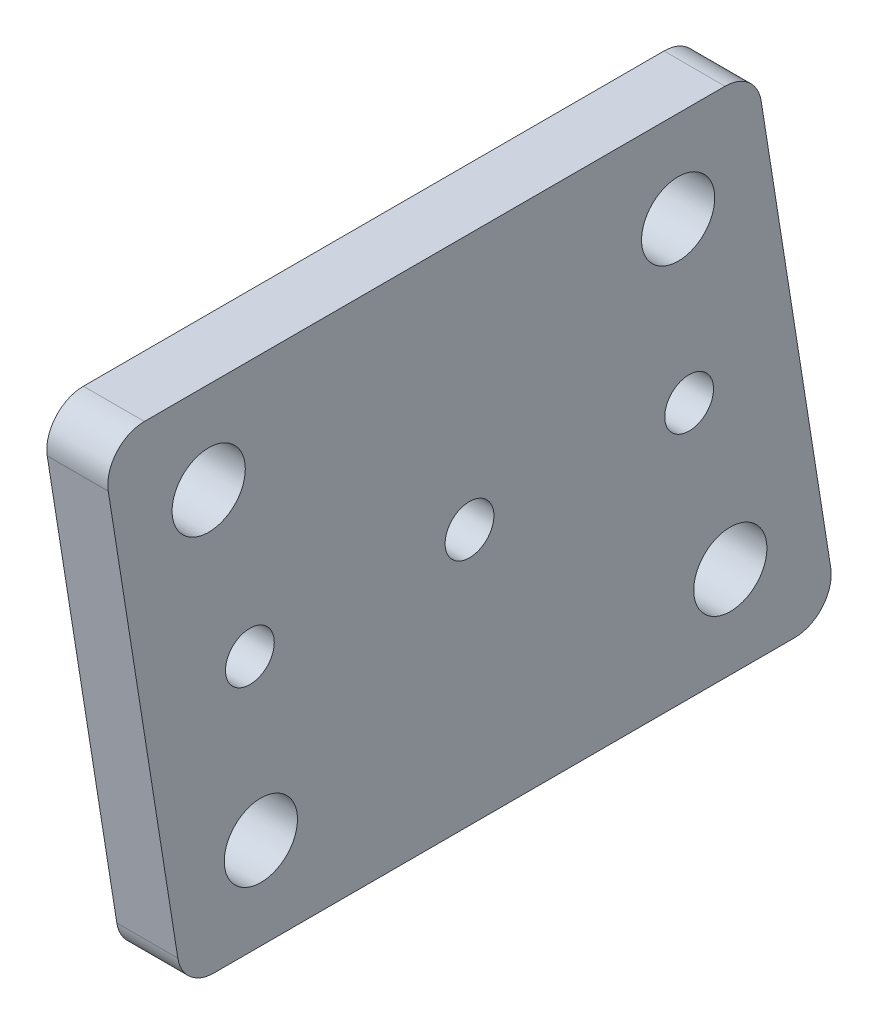
ISO-10303-21;
HEADER;
FILE_DESCRIPTION(('STEP AP214'),'2;1');
FILE_NAME('part.step','',(''),(''),'','','');
FILE_SCHEMA(('AUTOMOTIVE_DESIGN { 1 0 10303 214 1 1 1 1 }'));
ENDSEC;
DATA;
#1=APPLICATION_CONTEXT('core data for automotive mechanical design processes');
#2=APPLICATION_PROTOCOL_DEFINITION('international standard','automotive_design',2000,#1);
#3=PRODUCT_CONTEXT('',#1,'mechanical');
#4=PRODUCT('Part','Part','',(#3));
#5=PRODUCT_RELATED_PRODUCT_CATEGORY('part','',(#4));
#6=PRODUCT_DEFINITION_FORMATION('','',#4);
#7=PRODUCT_DEFINITION_CONTEXT('part definition',#1,'design');
#8=PRODUCT_DEFINITION('design','',#6,#7);
#9=PRODUCT_DEFINITION_SHAPE('','',#8);
#10=(LENGTH_UNIT() NAMED_UNIT(*) SI_UNIT(.MILLI.,.METRE.));
#11=(NAMED_UNIT(*) PLANE_ANGLE_UNIT() SI_UNIT($,.RADIAN.));
#12=(NAMED_UNIT(*) SI_UNIT($,.STERADIAN.) SOLID_ANGLE_UNIT());
#13=UNCERTAINTY_MEASURE_WITH_UNIT(LENGTH_MEASURE(1.E-05),#10,'distance_accuracy_value','');
#14=(GEOMETRIC_REPRESENTATION_CONTEXT(3) GLOBAL_UNCERTAINTY_ASSIGNED_CONTEXT((#13)) GLOBAL_UNIT_ASSIGNED_CONTEXT((#10,
#11,#12)) REPRESENTATION_CONTEXT('',''));
#15=CARTESIAN_POINT('',(0.,0.,0.));
#16=DIRECTION('',(0.,0.,1.));
#17=DIRECTION('',(1.,0.,0.));
#18=AXIS2_PLACEMENT_3D('',#15,#16,#17);
#19=CARTESIAN_POINT('',(5.,0.,0.));
#20=DIRECTION('',(1.,0.,0.));
#21=DIRECTION('',(0.,0.,-1.));
#22=AXIS2_PLACEMENT_3D('',#19,#20,#21);
#23=PLANE('',#22);
#24=CARTESIAN_POINT('',(5.,13.5,0.901352554409224));
#25=DIRECTION('',(1.,0.,0.));
#26=DIRECTION('',(0.,0.,-1.));
#27=AXIS2_PLACEMENT_3D('',#24,#25,#26);
#28=CIRCLE('',#27,2.);
#29=CARTESIAN_POINT('',(5.,13.5,-1.09864744559078));
#30=VERTEX_POINT('',#29);
#31=EDGE_CURVE('E205',#30,#30,#28,.T.);
#32=ORIENTED_EDGE('',*,*,#31,.F.);
#33=EDGE_LOOP('',(#32));
#34=FACE_BOUND('',#33,.T.);
#35=CARTESIAN_POINT('',(5.,27.,-34.1972948911816));
#36=DIRECTION('',(1.,0.,0.));
#37=DIRECTION('',(0.,0.,-1.));
#38=AXIS2_PLACEMENT_3D('',#35,#36,#37);
#39=CIRCLE('',#38,2.99999999999999);
#40=CARTESIAN_POINT('',(5.,27.,-37.1972948911815));
#41=VERTEX_POINT('',#40);
#42=EDGE_CURVE('E193',#41,#41,#39,.T.);
#43=ORIENTED_EDGE('',*,*,#42,.F.);
#44=EDGE_LOOP('',(#43));
#45=FACE_BOUND('',#44,.T.);
#46=CARTESIAN_POINT('',(5.,0.,-38.4736747799441));
#47=DIRECTION('',(1.,0.,0.));
#48=DIRECTION('',(0.,0.,-1.));
#49=AXIS2_PLACEMENT_3D('',#46,#47,#48);
#50=CIRCLE('',#49,3.);
#51=CARTESIAN_POINT('',(5.,0.,-41.4736747799441));
#52=VERTEX_POINT('',#51);
#53=EDGE_CURVE('E182',#52,#52,#50,.T.);
#54=ORIENTED_EDGE('',*,*,#53,.F.);
#55=EDGE_LOOP('',(#54));
#56=FACE_BOUND('',#55,.T.);
#57=DIRECTION('',(0.,0.987688340595137,0.156434465040235));
#58=VECTOR('',#57,1.);
#59=CARTESIAN_POINT('',(5.,-7.5,-47.2550465257882));
#60=LINE('',#59,#58);
#61=CARTESIAN_POINT('',(5.,-4.0306966048793,-46.705562849236));
#62=VERTEX_POINT('',#61);
#63=CARTESIAN_POINT('',(5.,31.9693033951207,-41.0037229975525));
#64=VERTEX_POINT('',#63);
#65=EDGE_CURVE('E177',#62,#64,#60,.T.);
#66=ORIENTED_EDGE('',*,*,#65,.T.);
#67=CARTESIAN_POINT('',(5.,31.5,-38.0406579757671));
#68=DIRECTION('',(1.,0.,0.));
#69=DIRECTION('',(0.,0.,-1.));
#70=AXIS2_PLACEMENT_3D('',#67,#68,#69);
#71=CIRCLE('',#70,3.);
#72=CARTESIAN_POINT('',(5.,34.5,-38.0406579757671));
#73=VERTEX_POINT('',#72);
#74=EDGE_CURVE('E154',#64,#73,#71,.T.);
#75=ORIENTED_EDGE('',*,*,#74,.T.);
#76=DIRECTION('',(0.,0.,1.));
#77=VECTOR('',#76,1.);
#78=CARTESIAN_POINT('',(5.,34.5,-40.6029000321575));
#79=LINE('',#78,#77);
#80=CARTESIAN_POINT('',(5.,34.5,9.54520293626902));
#81=VERTEX_POINT('',#80);
#82=EDGE_CURVE('E125',#73,#81,#79,.T.);
#83=ORIENTED_EDGE('',*,*,#82,.T.);
#84=CARTESIAN_POINT('',(5.,31.5,9.54520293626903));
#85=DIRECTION('',(1.,0.,0.));
#86=DIRECTION('',(0.,0.,-1.));
#87=AXIS2_PLACEMENT_3D('',#84,#85,#86);
#88=CIRCLE('',#87,3.);
#89=CARTESIAN_POINT('',(5.,31.0306966048793,12.5082679580544));
#90=VERTEX_POINT('',#89);
#91=EDGE_CURVE('E149',#81,#90,#88,.T.);
#92=ORIENTED_EDGE('',*,*,#91,.T.);
#93=DIRECTION('',(0.,-0.987688340595137,-0.156434465040235));
#94=VECTOR('',#93,1.);
#95=CARTESIAN_POINT('',(5.,34.5,13.0577516346067));
#96=LINE('',#95,#94);
#97=CARTESIAN_POINT('',(5.,-4.96930339512069,6.806428106371));
#98=VERTEX_POINT('',#97);
#99=EDGE_CURVE('E132',#90,#98,#96,.T.);
#100=ORIENTED_EDGE('',*,*,#99,.T.);
#101=CARTESIAN_POINT('',(5.,-4.5,3.84336308458558));
#102=DIRECTION('',(1.,0.,0.));
#103=DIRECTION('',(0.,0.,-1.));
#104=AXIS2_PLACEMENT_3D('',#101,#102,#103);
#105=CIRCLE('',#104,3.);
#106=CARTESIAN_POINT('',(5.,-7.5,3.84336308458559));
#107=VERTEX_POINT('',#106);
#108=EDGE_CURVE('E61',#98,#107,#105,.T.);
#109=ORIENTED_EDGE('',*,*,#108,.T.);
#110=DIRECTION('',(0.,0.,-1.));
#111=VECTOR('',#110,1.);
#112=CARTESIAN_POINT('',(5.,-7.5,6.40560514097597));
#113=LINE('',#112,#111);
#114=CARTESIAN_POINT('',(5.,-7.5,-43.7424978274506));
#115=VERTEX_POINT('',#114);
#116=EDGE_CURVE('E135',#107,#115,#113,.T.);
#117=ORIENTED_EDGE('',*,*,#116,.T.);
#118=CARTESIAN_POINT('',(5.,-4.5,-43.7424978274506));
#119=DIRECTION('',(1.,0.,0.));
#120=DIRECTION('',(0.,0.,-1.));
#121=AXIS2_PLACEMENT_3D('',#118,#119,#120);
#122=CIRCLE('',#121,3.);
#123=EDGE_CURVE('E152',#115,#62,#122,.T.);
#124=ORIENTED_EDGE('',*,*,#123,.T.);
#125=EDGE_LOOP('',(#66,#75,#83,#92,#100,#109,#117,#124));
#126=FACE_BOUND('',#125,.T.);
#127=CARTESIAN_POINT('',(5.,0.,0.));
#128=DIRECTION('',(1.,0.,0.));
#129=DIRECTION('',(0.,0.,-1.));
#130=AXIS2_PLACEMENT_3D('',#127,#128,#129);
#131=CIRCLE('',#130,3.);
#132=CARTESIAN_POINT('',(5.,0.,-3.));
#133=VERTEX_POINT('',#132);
#134=EDGE_CURVE('E170',#133,#133,#131,.T.);
#135=ORIENTED_EDGE('',*,*,#134,.F.);
#136=EDGE_LOOP('',(#135));
#137=FACE_BOUND('',#136,.T.);
#138=CARTESIAN_POINT('',(5.,27.,4.27637988876258));
#139=DIRECTION('',(1.,0.,0.));
#140=DIRECTION('',(0.,0.,-1.));
#141=AXIS2_PLACEMENT_3D('',#138,#139,#140);
#142=CIRCLE('',#141,3.);
#143=CARTESIAN_POINT('',(5.,27.,1.27637988876258));
#144=VERTEX_POINT('',#143);
#145=EDGE_CURVE('E187',#144,#144,#142,.T.);
#146=ORIENTED_EDGE('',*,*,#145,.F.);
#147=EDGE_LOOP('',(#146));
#148=FACE_BOUND('',#147,.T.);
#149=CARTESIAN_POINT('',(5.,13.5,-17.0986474455908));
#150=DIRECTION('',(1.,0.,0.));
#151=DIRECTION('',(0.,0.,-1.));
#152=AXIS2_PLACEMENT_3D('',#149,#150,#151);
#153=CIRCLE('',#152,2.00000000000001);
#154=CARTESIAN_POINT('',(5.,13.5,-19.0986474455908));
#155=VERTEX_POINT('',#154);
#156=EDGE_CURVE('E199',#155,#155,#153,.T.);
#157=ORIENTED_EDGE('',*,*,#156,.F.);
#158=EDGE_LOOP('',(#157));
#159=FACE_BOUND('',#158,.T.);
#160=CARTESIAN_POINT('',(5.,13.5,-35.0986474455908));
#161=DIRECTION('',(1.,0.,0.));
#162=DIRECTION('',(0.,0.,-1.));
#163=AXIS2_PLACEMENT_3D('',#160,#161,#162);
#164=CIRCLE('',#163,2.);
#165=CARTESIAN_POINT('',(5.,13.5,-37.0986474455908));
#166=VERTEX_POINT('',#165);
#167=EDGE_CURVE('E211',#166,#166,#164,.T.);
#168=ORIENTED_EDGE('',*,*,#167,.F.);
#169=EDGE_LOOP('',(#168));
#170=FACE_BOUND('',#169,.T.);
#171=ADVANCED_FACE('F39',(#34,#45,#56,#126,#137,#148,#159,#170),#23,.T.);
#172=CARTESIAN_POINT('',(0.,0.,0.));
#173=DIRECTION('',(1.,0.,0.));
#174=DIRECTION('',(0.,0.,-1.));
#175=AXIS2_PLACEMENT_3D('',#172,#173,#174);
#176=PLANE('',#175);
#177=DIRECTION('',(0.,0.,1.));
#178=VECTOR('',#177,1.);
#179=CARTESIAN_POINT('',(0.,34.5,-40.6029000321575));
#180=LINE('',#179,#178);
#181=CARTESIAN_POINT('',(0.,34.5,-38.0406579757671));
#182=VERTEX_POINT('',#181);
#183=CARTESIAN_POINT('',(0.,34.5,9.54520293626902));
#184=VERTEX_POINT('',#183);
#185=EDGE_CURVE('E122',#182,#184,#180,.T.);
#186=ORIENTED_EDGE('',*,*,#185,.F.);
#187=CARTESIAN_POINT('',(0.,31.5,-38.0406579757671));
#188=DIRECTION('',(1.,0.,0.));
#189=DIRECTION('',(0.,0.,-1.));
#190=AXIS2_PLACEMENT_3D('',#187,#188,#189);
#191=CIRCLE('',#190,3.);
#192=CARTESIAN_POINT('',(0.,31.9693033951207,-41.0037229975525));
#193=VERTEX_POINT('',#192);
#194=EDGE_CURVE('E105',#182,#193,#191,.F.);
#195=ORIENTED_EDGE('',*,*,#194,.T.);
#196=DIRECTION('',(0.,0.987688340595137,0.156434465040235));
#197=VECTOR('',#196,1.);
#198=CARTESIAN_POINT('',(0.,-7.5,-47.2550465257882));
#199=LINE('',#198,#197);
#200=CARTESIAN_POINT('',(0.,-4.0306966048793,-46.705562849236));
#201=VERTEX_POINT('',#200);
#202=EDGE_CURVE('E133',#201,#193,#199,.T.);
#203=ORIENTED_EDGE('',*,*,#202,.F.);
#204=CARTESIAN_POINT('',(0.,-4.5,-43.7424978274506));
#205=DIRECTION('',(1.,0.,0.));
#206=DIRECTION('',(0.,0.,-1.));
#207=AXIS2_PLACEMENT_3D('',#204,#205,#206);
#208=CIRCLE('',#207,3.);
#209=CARTESIAN_POINT('',(0.,-7.5,-43.7424978274506));
#210=VERTEX_POINT('',#209);
#211=EDGE_CURVE('E116',#201,#210,#208,.F.);
#212=ORIENTED_EDGE('',*,*,#211,.T.);
#213=DIRECTION('',(0.,0.,-1.));
#214=VECTOR('',#213,1.);
#215=CARTESIAN_POINT('',(0.,-7.5,6.40560514097597));
#216=LINE('',#215,#214);
#217=CARTESIAN_POINT('',(0.,-7.5,3.84336308458559));
#218=VERTEX_POINT('',#217);
#219=EDGE_CURVE('E137',#218,#210,#216,.T.);
#220=ORIENTED_EDGE('',*,*,#219,.F.);
#221=CARTESIAN_POINT('',(0.,-4.5,3.84336308458558));
#222=DIRECTION('',(1.,0.,0.));
#223=DIRECTION('',(0.,0.,-1.));
#224=AXIS2_PLACEMENT_3D('',#221,#222,#223);
#225=CIRCLE('',#224,3.);
#226=CARTESIAN_POINT('',(0.,-4.96930339512069,6.806428106371));
#227=VERTEX_POINT('',#226);
#228=EDGE_CURVE('E143',#218,#227,#225,.F.);
#229=ORIENTED_EDGE('',*,*,#228,.T.);
#230=DIRECTION('',(0.,-0.987688340595137,-0.156434465040235));
#231=VECTOR('',#230,1.);
#232=CARTESIAN_POINT('',(0.,34.5,13.0577516346067));
#233=LINE('',#232,#231);
#234=CARTESIAN_POINT('',(0.,31.0306966048793,12.5082679580544));
#235=VERTEX_POINT('',#234);
#236=EDGE_CURVE('E165',#235,#227,#233,.T.);
#237=ORIENTED_EDGE('',*,*,#236,.F.);
#238=CARTESIAN_POINT('',(0.,31.5,9.54520293626903));
#239=DIRECTION('',(1.,0.,0.));
#240=DIRECTION('',(0.,0.,-1.));
#241=AXIS2_PLACEMENT_3D('',#238,#239,#240);
#242=CIRCLE('',#241,3.);
#243=EDGE_CURVE('E126',#235,#184,#242,.F.);
#244=ORIENTED_EDGE('',*,*,#243,.T.);
#245=EDGE_LOOP('',(#186,#195,#203,#212,#220,#229,#237,#244));
#246=FACE_BOUND('',#245,.T.);
#247=CARTESIAN_POINT('',(0.,0.,0.));
#248=DIRECTION('',(1.,0.,0.));
#249=DIRECTION('',(0.,0.,-1.));
#250=AXIS2_PLACEMENT_3D('',#247,#248,#249);
#251=CIRCLE('',#250,3.);
#252=CARTESIAN_POINT('',(0.,0.,-3.));
#253=VERTEX_POINT('',#252);
#254=EDGE_CURVE('E173',#253,#253,#251,.T.);
#255=ORIENTED_EDGE('',*,*,#254,.T.);
#256=EDGE_LOOP('',(#255));
#257=FACE_BOUND('',#256,.T.);
#258=CARTESIAN_POINT('',(0.,0.,-38.4736747799441));
#259=DIRECTION('',(1.,0.,0.));
#260=DIRECTION('',(0.,0.,-1.));
#261=AXIS2_PLACEMENT_3D('',#258,#259,#260);
#262=CIRCLE('',#261,3.);
#263=CARTESIAN_POINT('',(0.,0.,-41.4736747799441));
#264=VERTEX_POINT('',#263);
#265=EDGE_CURVE('E184',#264,#264,#262,.T.);
#266=ORIENTED_EDGE('',*,*,#265,.T.);
#267=EDGE_LOOP('',(#266));
#268=FACE_BOUND('',#267,.T.);
#269=CARTESIAN_POINT('',(0.,27.,4.27637988876258));
#270=DIRECTION('',(1.,0.,0.));
#271=DIRECTION('',(0.,0.,-1.));
#272=AXIS2_PLACEMENT_3D('',#269,#270,#271);
#273=CIRCLE('',#272,3.);
#274=CARTESIAN_POINT('',(0.,27.,1.27637988876258));
#275=VERTEX_POINT('',#274);
#276=EDGE_CURVE('E190',#275,#275,#273,.T.);
#277=ORIENTED_EDGE('',*,*,#276,.T.);
#278=EDGE_LOOP('',(#277));
#279=FACE_BOUND('',#278,.T.);
#280=CARTESIAN_POINT('',(0.,27.,-34.1972948911816));
#281=DIRECTION('',(1.,0.,0.));
#282=DIRECTION('',(0.,0.,-1.));
#283=AXIS2_PLACEMENT_3D('',#280,#281,#282);
#284=CIRCLE('',#283,2.99999999999999);
#285=CARTESIAN_POINT('',(0.,27.,-37.1972948911815));
#286=VERTEX_POINT('',#285);
#287=EDGE_CURVE('E196',#286,#286,#284,.T.);
#288=ORIENTED_EDGE('',*,*,#287,.T.);
#289=EDGE_LOOP('',(#288));
#290=FACE_BOUND('',#289,.T.);
#291=CARTESIAN_POINT('',(0.,13.5,-17.0986474455908));
#292=DIRECTION('',(1.,0.,0.));
#293=DIRECTION('',(0.,0.,-1.));
#294=AXIS2_PLACEMENT_3D('',#291,#292,#293);
#295=CIRCLE('',#294,2.00000000000001);
#296=CARTESIAN_POINT('',(0.,13.5,-19.0986474455908));
#297=VERTEX_POINT('',#296);
#298=EDGE_CURVE('E202',#297,#297,#295,.T.);
#299=ORIENTED_EDGE('',*,*,#298,.T.);
#300=EDGE_LOOP('',(#299));
#301=FACE_BOUND('',#300,.T.);
#302=CARTESIAN_POINT('',(0.,13.5,0.901352554409224));
#303=DIRECTION('',(1.,0.,0.));
#304=DIRECTION('',(0.,0.,-1.));
#305=AXIS2_PLACEMENT_3D('',#302,#303,#304);
#306=CIRCLE('',#305,2.);
#307=CARTESIAN_POINT('',(0.,13.5,-1.09864744559078));
#308=VERTEX_POINT('',#307);
#309=EDGE_CURVE('E208',#308,#308,#306,.T.);
#310=ORIENTED_EDGE('',*,*,#309,.T.);
#311=EDGE_LOOP('',(#310));
#312=FACE_BOUND('',#311,.T.);
#313=CARTESIAN_POINT('',(0.,13.5,-35.0986474455908));
#314=DIRECTION('',(1.,0.,0.));
#315=DIRECTION('',(0.,0.,-1.));
#316=AXIS2_PLACEMENT_3D('',#313,#314,#315);
#317=CIRCLE('',#316,2.);
#318=CARTESIAN_POINT('',(0.,13.5,-37.0986474455908));
#319=VERTEX_POINT('',#318);
#320=EDGE_CURVE('E214',#319,#319,#317,.T.);
#321=ORIENTED_EDGE('',*,*,#320,.T.);
#322=EDGE_LOOP('',(#321));
#323=FACE_BOUND('',#322,.T.);
#324=ADVANCED_FACE('F129',(#246,#257,#268,#279,#290,#301,#312,#323),#176,.F.);
#325=CARTESIAN_POINT('',(5.,34.5,13.0577516346067));
#326=DIRECTION('',(0.,0.156434465040235,-0.987688340595137));
#327=DIRECTION('',(0.,0.987688340595137,0.156434465040235));
#328=AXIS2_PLACEMENT_3D('',#325,#326,#327);
#329=PLANE('',#328);
#330=ORIENTED_EDGE('',*,*,#236,.T.);
#331=DIRECTION('',(-1.,0.,0.));
#332=VECTOR('',#331,1.);
#333=CARTESIAN_POINT('',(5.,-4.96930339512069,6.806428106371));
#334=LINE('',#333,#332);
#335=EDGE_CURVE('E11',#227,#98,#334,.F.);
#336=ORIENTED_EDGE('',*,*,#335,.T.);
#337=ORIENTED_EDGE('',*,*,#99,.F.);
#338=DIRECTION('',(-1.,0.,0.));
#339=VECTOR('',#338,1.);
#340=CARTESIAN_POINT('',(5.,31.0306966048793,12.5082679580544));
#341=LINE('',#340,#339);
#342=EDGE_CURVE('E47',#90,#235,#341,.T.);
#343=ORIENTED_EDGE('',*,*,#342,.T.);
#344=EDGE_LOOP('',(#330,#336,#337,#343));
#345=FACE_BOUND('',#344,.T.);
#346=ADVANCED_FACE('F164',(#345),#329,.F.);
#347=CARTESIAN_POINT('',(5.,-7.5,6.40560514097597));
#348=DIRECTION('',(0.,1.,0.));
#349=DIRECTION('',(0.,0.,1.));
#350=AXIS2_PLACEMENT_3D('',#347,#348,#349);
#351=PLANE('',#350);
#352=ORIENTED_EDGE('',*,*,#219,.T.);
#353=DIRECTION('',(-1.,0.,0.));
#354=VECTOR('',#353,1.);
#355=CARTESIAN_POINT('',(5.,-7.5,-43.7424978274506));
#356=LINE('',#355,#354);
#357=EDGE_CURVE('E54',#210,#115,#356,.F.);
#358=ORIENTED_EDGE('',*,*,#357,.T.);
#359=ORIENTED_EDGE('',*,*,#116,.F.);
#360=DIRECTION('',(-1.,0.,0.));
#361=VECTOR('',#360,1.);
#362=CARTESIAN_POINT('',(5.,-7.5,3.84336308458558));
#363=LINE('',#362,#361);
#364=EDGE_CURVE('E156',#107,#218,#363,.T.);
#365=ORIENTED_EDGE('',*,*,#364,.T.);
#366=EDGE_LOOP('',(#352,#358,#359,#365));
#367=FACE_BOUND('',#366,.T.);
#368=ADVANCED_FACE('F242',(#367),#351,.F.);
#369=CARTESIAN_POINT('',(5.,-7.5,-47.2550465257882));
#370=DIRECTION('',(0.,-0.156434465040235,0.987688340595137));
#371=DIRECTION('',(0.,-0.987688340595137,-0.156434465040235));
#372=AXIS2_PLACEMENT_3D('',#369,#370,#371);
#373=PLANE('',#372);
#374=ORIENTED_EDGE('',*,*,#202,.T.);
#375=DIRECTION('',(-1.,0.,0.));
#376=VECTOR('',#375,1.);
#377=CARTESIAN_POINT('',(5.,31.9693033951207,-41.0037229975525));
#378=LINE('',#377,#376);
#379=EDGE_CURVE('E110',#193,#64,#378,.F.);
#380=ORIENTED_EDGE('',*,*,#379,.T.);
#381=ORIENTED_EDGE('',*,*,#65,.F.);
#382=DIRECTION('',(-1.,0.,0.));
#383=VECTOR('',#382,1.);
#384=CARTESIAN_POINT('',(5.,-4.0306966048793,-46.705562849236));
#385=LINE('',#384,#383);
#386=EDGE_CURVE('E115',#62,#201,#385,.T.);
#387=ORIENTED_EDGE('',*,*,#386,.T.);
#388=EDGE_LOOP('',(#374,#380,#381,#387));
#389=FACE_BOUND('',#388,.T.);
#390=ADVANCED_FACE('F239',(#389),#373,.F.);
#391=CARTESIAN_POINT('',(5.,34.5,-40.6029000321575));
#392=DIRECTION('',(0.,-1.,0.));
#393=DIRECTION('',(0.,0.,-1.));
#394=AXIS2_PLACEMENT_3D('',#391,#392,#393);
#395=PLANE('',#394);
#396=ORIENTED_EDGE('',*,*,#82,.F.);
#397=DIRECTION('',(-1.,0.,0.));
#398=VECTOR('',#397,1.);
#399=CARTESIAN_POINT('',(5.,34.5,-38.0406579757671));
#400=LINE('',#399,#398);
#401=EDGE_CURVE('E109',#73,#182,#400,.T.);
#402=ORIENTED_EDGE('',*,*,#401,.T.);
#403=ORIENTED_EDGE('',*,*,#185,.T.);
#404=DIRECTION('',(-1.,0.,0.));
#405=VECTOR('',#404,1.);
#406=CARTESIAN_POINT('',(5.,34.5,9.54520293626902));
#407=LINE('',#406,#405);
#408=EDGE_CURVE('E127',#184,#81,#407,.F.);
#409=ORIENTED_EDGE('',*,*,#408,.T.);
#410=EDGE_LOOP('',(#396,#402,#403,#409));
#411=FACE_BOUND('',#410,.T.);
#412=ADVANCED_FACE('F121',(#411),#395,.F.);
#413=CARTESIAN_POINT('',(5.,0.,0.));
#414=DIRECTION('',(-1.,0.,0.));
#415=DIRECTION('',(0.,0.,1.));
#416=AXIS2_PLACEMENT_3D('',#413,#414,#415);
#417=CYLINDRICAL_SURFACE('',#416,3.);
#418=ORIENTED_EDGE('',*,*,#134,.T.);
#419=EDGE_LOOP('',(#418));
#420=FACE_BOUND('',#419,.T.);
#421=ORIENTED_EDGE('',*,*,#254,.F.);
#422=EDGE_LOOP('',(#421));
#423=FACE_BOUND('',#422,.T.);
#424=ADVANCED_FACE('F234',(#420,#423),#417,.F.);
#425=CARTESIAN_POINT('',(5.,0.,-38.4736747799441));
#426=DIRECTION('',(-1.,0.,0.));
#427=DIRECTION('',(0.,0.,1.));
#428=AXIS2_PLACEMENT_3D('',#425,#426,#427);
#429=CYLINDRICAL_SURFACE('',#428,3.);
#430=ORIENTED_EDGE('',*,*,#53,.T.);
#431=EDGE_LOOP('',(#430));
#432=FACE_BOUND('',#431,.T.);
#433=ORIENTED_EDGE('',*,*,#265,.F.);
#434=EDGE_LOOP('',(#433));
#435=FACE_BOUND('',#434,.T.);
#436=ADVANCED_FACE('F294',(#432,#435),#429,.F.);
#437=CARTESIAN_POINT('',(5.,27.,4.27637988876258));
#438=DIRECTION('',(-1.,0.,0.));
#439=DIRECTION('',(0.,0.,1.));
#440=AXIS2_PLACEMENT_3D('',#437,#438,#439);
#441=CYLINDRICAL_SURFACE('',#440,3.);
#442=ORIENTED_EDGE('',*,*,#145,.T.);
#443=EDGE_LOOP('',(#442));
#444=FACE_BOUND('',#443,.T.);
#445=ORIENTED_EDGE('',*,*,#276,.F.);
#446=EDGE_LOOP('',(#445));
#447=FACE_BOUND('',#446,.T.);
#448=ADVANCED_FACE('F291',(#444,#447),#441,.F.);
#449=CARTESIAN_POINT('',(5.,27.,-34.1972948911816));
#450=DIRECTION('',(-1.,0.,0.));
#451=DIRECTION('',(0.,0.,1.));
#452=AXIS2_PLACEMENT_3D('',#449,#450,#451);
#453=CYLINDRICAL_SURFACE('',#452,2.99999999999999);
#454=ORIENTED_EDGE('',*,*,#42,.T.);
#455=EDGE_LOOP('',(#454));
#456=FACE_BOUND('',#455,.T.);
#457=ORIENTED_EDGE('',*,*,#287,.F.);
#458=EDGE_LOOP('',(#457));
#459=FACE_BOUND('',#458,.T.);
#460=ADVANCED_FACE('F274',(#456,#459),#453,.F.);
#461=CARTESIAN_POINT('',(5.,13.5,-17.0986474455908));
#462=DIRECTION('',(-1.,0.,0.));
#463=DIRECTION('',(0.,0.,1.));
#464=AXIS2_PLACEMENT_3D('',#461,#462,#463);
#465=CYLINDRICAL_SURFACE('',#464,2.00000000000001);
#466=ORIENTED_EDGE('',*,*,#156,.T.);
#467=EDGE_LOOP('',(#466));
#468=FACE_BOUND('',#467,.T.);
#469=ORIENTED_EDGE('',*,*,#298,.F.);
#470=EDGE_LOOP('',(#469));
#471=FACE_BOUND('',#470,.T.);
#472=ADVANCED_FACE('F270',(#468,#471),#465,.F.);
#473=CARTESIAN_POINT('',(5.,13.5,0.901352554409224));
#474=DIRECTION('',(-1.,0.,0.));
#475=DIRECTION('',(0.,0.,1.));
#476=AXIS2_PLACEMENT_3D('',#473,#474,#475);
#477=CYLINDRICAL_SURFACE('',#476,2.);
#478=ORIENTED_EDGE('',*,*,#31,.T.);
#479=EDGE_LOOP('',(#478));
#480=FACE_BOUND('',#479,.T.);
#481=ORIENTED_EDGE('',*,*,#309,.F.);
#482=EDGE_LOOP('',(#481));
#483=FACE_BOUND('',#482,.T.);
#484=ADVANCED_FACE('F273',(#480,#483),#477,.F.);
#485=CARTESIAN_POINT('',(5.,13.5,-35.0986474455908));
#486=DIRECTION('',(-1.,0.,0.));
#487=DIRECTION('',(0.,0.,1.));
#488=AXIS2_PLACEMENT_3D('',#485,#486,#487);
#489=CYLINDRICAL_SURFACE('',#488,2.);
#490=ORIENTED_EDGE('',*,*,#167,.T.);
#491=EDGE_LOOP('',(#490));
#492=FACE_BOUND('',#491,.T.);
#493=ORIENTED_EDGE('',*,*,#320,.F.);
#494=EDGE_LOOP('',(#493));
#495=FACE_BOUND('',#494,.T.);
#496=ADVANCED_FACE('F220',(#492,#495),#489,.F.);
#497=CARTESIAN_POINT('',(5.,31.5,-38.0406579757671));
#498=DIRECTION('',(-1.,0.,0.));
#499=DIRECTION('',(0.,0.,1.));
#500=AXIS2_PLACEMENT_3D('',#497,#498,#499);
#501=CYLINDRICAL_SURFACE('',#500,3.);
#502=ORIENTED_EDGE('',*,*,#74,.F.);
#503=ORIENTED_EDGE('',*,*,#379,.F.);
#504=ORIENTED_EDGE('',*,*,#194,.F.);
#505=ORIENTED_EDGE('',*,*,#401,.F.);
#506=EDGE_LOOP('',(#502,#503,#504,#505));
#507=FACE_BOUND('',#506,.T.);
#508=ADVANCED_FACE('F108',(#507),#501,.T.);
#509=CARTESIAN_POINT('',(5.,-4.5,-43.7424978274506));
#510=DIRECTION('',(-1.,0.,0.));
#511=DIRECTION('',(0.,0.,1.));
#512=AXIS2_PLACEMENT_3D('',#509,#510,#511);
#513=CYLINDRICAL_SURFACE('',#512,3.);
#514=ORIENTED_EDGE('',*,*,#123,.F.);
#515=ORIENTED_EDGE('',*,*,#357,.F.);
#516=ORIENTED_EDGE('',*,*,#211,.F.);
#517=ORIENTED_EDGE('',*,*,#386,.F.);
#518=EDGE_LOOP('',(#514,#515,#516,#517));
#519=FACE_BOUND('',#518,.T.);
#520=ADVANCED_FACE('F250',(#519),#513,.T.);
#521=CARTESIAN_POINT('',(5.,-4.5,3.84336308458558));
#522=DIRECTION('',(-1.,0.,0.));
#523=DIRECTION('',(0.,0.,1.));
#524=AXIS2_PLACEMENT_3D('',#521,#522,#523);
#525=CYLINDRICAL_SURFACE('',#524,3.);
#526=ORIENTED_EDGE('',*,*,#108,.F.);
#527=ORIENTED_EDGE('',*,*,#335,.F.);
#528=ORIENTED_EDGE('',*,*,#228,.F.);
#529=ORIENTED_EDGE('',*,*,#364,.F.);
#530=EDGE_LOOP('',(#526,#527,#528,#529));
#531=FACE_BOUND('',#530,.T.);
#532=ADVANCED_FACE('F252',(#531),#525,.T.);
#533=CARTESIAN_POINT('',(5.,31.5,9.54520293626903));
#534=DIRECTION('',(-1.,0.,0.));
#535=DIRECTION('',(0.,0.,1.));
#536=AXIS2_PLACEMENT_3D('',#533,#534,#535);
#537=CYLINDRICAL_SURFACE('',#536,3.);
#538=ORIENTED_EDGE('',*,*,#91,.F.);
#539=ORIENTED_EDGE('',*,*,#408,.F.);
#540=ORIENTED_EDGE('',*,*,#243,.F.);
#541=ORIENTED_EDGE('',*,*,#342,.F.);
#542=EDGE_LOOP('',(#538,#539,#540,#541));
#543=FACE_BOUND('',#542,.T.);
#544=ADVANCED_FACE('F41',(#543),#537,.T.);
#545=CLOSED_SHELL('',(#171,#324,#346,#368,#390,#412,#424,#436,#448,#460,#472,#484,#496,#508,
#520,#532,#544));
#546=MANIFOLD_SOLID_BREP('B2',#545);
#547=ADVANCED_BREP_SHAPE_REPRESENTATION('',(#18,#546),#14);
#548=SHAPE_DEFINITION_REPRESENTATION(#9,#547);
ENDSEC;
END-ISO-10303-21;
